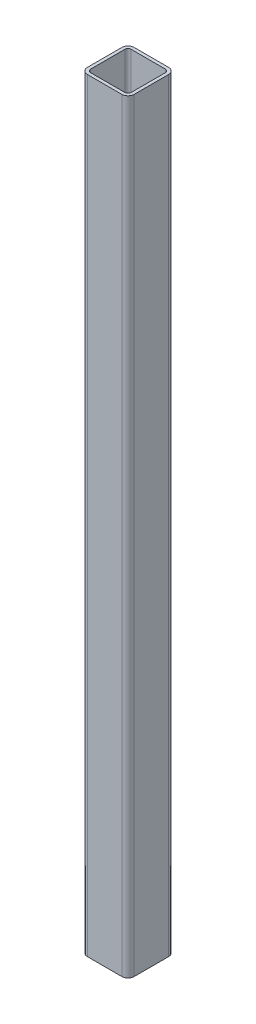
ISO-10303-21;
HEADER;
FILE_DESCRIPTION(('STEP AP214'),'2;1');
FILE_NAME('part.step','',(''),(''),'','','');
FILE_SCHEMA(('AUTOMOTIVE_DESIGN { 1 0 10303 214 1 1 1 1 }'));
ENDSEC;
DATA;
#1=APPLICATION_CONTEXT('core data for automotive mechanical design processes');
#2=APPLICATION_PROTOCOL_DEFINITION('international standard','automotive_design',2000,#1);
#3=PRODUCT_CONTEXT('',#1,'mechanical');
#4=PRODUCT('Part','Part','',(#3));
#5=PRODUCT_RELATED_PRODUCT_CATEGORY('part','',(#4));
#6=PRODUCT_DEFINITION_FORMATION('','',#4);
#7=PRODUCT_DEFINITION_CONTEXT('part definition',#1,'design');
#8=PRODUCT_DEFINITION('design','',#6,#7);
#9=PRODUCT_DEFINITION_SHAPE('','',#8);
#10=(LENGTH_UNIT() NAMED_UNIT(*) SI_UNIT(.MILLI.,.METRE.));
#11=(NAMED_UNIT(*) PLANE_ANGLE_UNIT() SI_UNIT($,.RADIAN.));
#12=(NAMED_UNIT(*) SI_UNIT($,.STERADIAN.) SOLID_ANGLE_UNIT());
#13=UNCERTAINTY_MEASURE_WITH_UNIT(LENGTH_MEASURE(1.E-05),#10,'distance_accuracy_value','');
#14=(GEOMETRIC_REPRESENTATION_CONTEXT(3) GLOBAL_UNCERTAINTY_ASSIGNED_CONTEXT((#13)) GLOBAL_UNIT_ASSIGNED_CONTEXT((#10,
#11,#12)) REPRESENTATION_CONTEXT('',''));
#15=CARTESIAN_POINT('',(0.,0.,0.));
#16=DIRECTION('',(0.,0.,1.));
#17=DIRECTION('',(1.,0.,0.));
#18=AXIS2_PLACEMENT_3D('',#15,#16,#17);
#19=CARTESIAN_POINT('',(4.00000000000003,245.,-30.));
#20=DIRECTION('',(0.,0.,1.));
#21=DIRECTION('',(1.,0.,0.));
#22=AXIS2_PLACEMENT_3D('',#19,#20,#21);
#23=PLANE('',#22);
#24=DIRECTION('',(1.,0.,0.));
#25=VECTOR('',#24,1.);
#26=CARTESIAN_POINT('',(0.,-20.,-30.));
#27=LINE('',#26,#25);
#28=CARTESIAN_POINT('',(4.,-20.,-30.));
#29=VERTEX_POINT('',#28);
#30=CARTESIAN_POINT('',(23.,-20.,-30.));
#31=VERTEX_POINT('',#30);
#32=EDGE_CURVE('E389',#29,#31,#27,.T.);
#33=ORIENTED_EDGE('',*,*,#32,.T.);
#34=DIRECTION('',(0.,1.,0.));
#35=VECTOR('',#34,1.);
#36=CARTESIAN_POINT('',(23.,20.,-30.));
#37=LINE('',#36,#35);
#38=CARTESIAN_POINT('',(23.,20.,-30.));
#39=VERTEX_POINT('',#38);
#40=EDGE_CURVE('E384',#31,#39,#37,.T.);
#41=ORIENTED_EDGE('',*,*,#40,.T.);
#42=DIRECTION('',(-1.,0.,0.));
#43=VECTOR('',#42,1.);
#44=CARTESIAN_POINT('',(0.,20.,-30.));
#45=LINE('',#44,#43);
#46=CARTESIAN_POINT('',(4.,20.,-30.));
#47=VERTEX_POINT('',#46);
#48=EDGE_CURVE('E207',#39,#47,#45,.T.);
#49=ORIENTED_EDGE('',*,*,#48,.T.);
#50=DIRECTION('',(0.,-1.,0.));
#51=VECTOR('',#50,1.);
#52=CARTESIAN_POINT('',(4.00000000000003,245.,-30.));
#53=LINE('',#52,#51);
#54=CARTESIAN_POINT('',(4.00000000000003,245.,-30.));
#55=VERTEX_POINT('',#54);
#56=EDGE_CURVE('E344',#55,#47,#53,.T.);
#57=ORIENTED_EDGE('',*,*,#56,.F.);
#58=DIRECTION('',(-1.,0.,0.));
#59=VECTOR('',#58,1.);
#60=CARTESIAN_POINT('',(4.00000000000003,245.,-30.));
#61=LINE('',#60,#59);
#62=CARTESIAN_POINT('',(26.,245.,-30.));
#63=VERTEX_POINT('',#62);
#64=EDGE_CURVE('E315',#63,#55,#61,.T.);
#65=ORIENTED_EDGE('',*,*,#64,.F.);
#66=DIRECTION('',(0.,-1.,0.));
#67=VECTOR('',#66,1.);
#68=CARTESIAN_POINT('',(26.,245.,-30.));
#69=LINE('',#68,#67);
#70=CARTESIAN_POINT('',(26.,-245.,-30.));
#71=VERTEX_POINT('',#70);
#72=EDGE_CURVE('E347',#63,#71,#69,.T.);
#73=ORIENTED_EDGE('',*,*,#72,.T.);
#74=DIRECTION('',(-1.,0.,0.));
#75=VECTOR('',#74,1.);
#76=CARTESIAN_POINT('',(4.00000000000003,-245.,-30.));
#77=LINE('',#76,#75);
#78=CARTESIAN_POINT('',(4.00000000000003,-245.,-30.));
#79=VERTEX_POINT('',#78);
#80=EDGE_CURVE('E332',#71,#79,#77,.T.);
#81=ORIENTED_EDGE('',*,*,#80,.T.);
#82=EDGE_CURVE('E343',#29,#79,#53,.T.);
#83=ORIENTED_EDGE('',*,*,#82,.F.);
#84=EDGE_LOOP('',(#33,#41,#49,#57,#65,#73,#81,#83));
#85=FACE_BOUND('',#84,.T.);
#86=ADVANCED_FACE('F34',(#85),#23,.F.);
#87=CARTESIAN_POINT('',(4.,245.,-26.));
#88=DIRECTION('',(0.,-1.,0.));
#89=DIRECTION('',(0.,0.,-1.));
#90=AXIS2_PLACEMENT_3D('',#87,#88,#89);
#91=CYLINDRICAL_SURFACE('',#90,4.);
#92=CARTESIAN_POINT('',(4.,-20.,-26.));
#93=DIRECTION('',(0.,1.,0.));
#94=DIRECTION('',(-1.,0.,0.));
#95=AXIS2_PLACEMENT_3D('',#92,#93,#94);
#96=CIRCLE('',#95,4.);
#97=CARTESIAN_POINT('',(0.,-20.,-26.));
#98=VERTEX_POINT('',#97);
#99=EDGE_CURVE('E237',#29,#98,#96,.T.);
#100=ORIENTED_EDGE('',*,*,#99,.F.);
#101=ORIENTED_EDGE('',*,*,#82,.T.);
#102=CARTESIAN_POINT('',(4.,-245.,-26.));
#103=DIRECTION('',(0.,1.,0.));
#104=DIRECTION('',(0.,0.,-1.));
#105=AXIS2_PLACEMENT_3D('',#102,#103,#104);
#106=CIRCLE('',#105,4.);
#107=CARTESIAN_POINT('',(0.,-245.,-26.));
#108=VERTEX_POINT('',#107);
#109=EDGE_CURVE('E335',#79,#108,#106,.T.);
#110=ORIENTED_EDGE('',*,*,#109,.T.);
#111=DIRECTION('',(0.,-1.,0.));
#112=VECTOR('',#111,1.);
#113=CARTESIAN_POINT('',(0.,245.,-26.));
#114=LINE('',#113,#112);
#115=EDGE_CURVE('E341',#98,#108,#114,.T.);
#116=ORIENTED_EDGE('',*,*,#115,.F.);
#117=EDGE_LOOP('',(#100,#101,#110,#116));
#118=FACE_BOUND('',#117,.T.);
#119=ADVANCED_FACE('F396',(#118),#91,.T.);
#120=CARTESIAN_POINT('',(4.,20.,-26.));
#121=DIRECTION('',(0.,-1.,0.));
#122=DIRECTION('',(1.,0.,0.));
#123=AXIS2_PLACEMENT_3D('',#120,#121,#122);
#124=CIRCLE('',#123,4.);
#125=CARTESIAN_POINT('',(0.,20.,-26.));
#126=VERTEX_POINT('',#125);
#127=EDGE_CURVE('E229',#126,#47,#124,.T.);
#128=ORIENTED_EDGE('',*,*,#127,.F.);
#129=CARTESIAN_POINT('',(0.,245.,-26.));
#130=VERTEX_POINT('',#129);
#131=EDGE_CURVE('E213',#130,#126,#114,.T.);
#132=ORIENTED_EDGE('',*,*,#131,.F.);
#133=CARTESIAN_POINT('',(4.,245.,-26.));
#134=DIRECTION('',(0.,1.,0.));
#135=DIRECTION('',(0.,0.,-1.));
#136=AXIS2_PLACEMENT_3D('',#133,#134,#135);
#137=CIRCLE('',#136,4.);
#138=EDGE_CURVE('E317',#55,#130,#137,.T.);
#139=ORIENTED_EDGE('',*,*,#138,.F.);
#140=ORIENTED_EDGE('',*,*,#56,.T.);
#141=EDGE_LOOP('',(#128,#132,#139,#140));
#142=FACE_BOUND('',#141,.T.);
#143=ADVANCED_FACE('F420',(#142),#91,.T.);
#144=CARTESIAN_POINT('',(0.,245.,-4.00000000000003));
#145=DIRECTION('',(1.,0.,0.));
#146=DIRECTION('',(0.,0.,-1.));
#147=AXIS2_PLACEMENT_3D('',#144,#145,#146);
#148=PLANE('',#147);
#149=DIRECTION('',(0.,0.,-1.));
#150=VECTOR('',#149,1.);
#151=CARTESIAN_POINT('',(0.,-20.,-12.));
#152=LINE('',#151,#150);
#153=CARTESIAN_POINT('',(0.,-20.,-12.));
#154=VERTEX_POINT('',#153);
#155=EDGE_CURVE('E49',#154,#98,#152,.T.);
#156=ORIENTED_EDGE('',*,*,#155,.T.);
#157=ORIENTED_EDGE('',*,*,#115,.T.);
#158=DIRECTION('',(0.,0.,1.));
#159=VECTOR('',#158,1.);
#160=CARTESIAN_POINT('',(0.,-245.,-4.00000000000003));
#161=LINE('',#160,#159);
#162=CARTESIAN_POINT('',(0.,-245.,-4.00000000000003));
#163=VERTEX_POINT('',#162);
#164=EDGE_CURVE('E307',#108,#163,#161,.T.);
#165=ORIENTED_EDGE('',*,*,#164,.T.);
#166=DIRECTION('',(0.,-1.,0.));
#167=VECTOR('',#166,1.);
#168=CARTESIAN_POINT('',(0.,245.,-4.00000000000003));
#169=LINE('',#168,#167);
#170=CARTESIAN_POINT('',(0.,245.,-4.00000000000003));
#171=VERTEX_POINT('',#170);
#172=EDGE_CURVE('E321',#171,#163,#169,.T.);
#173=ORIENTED_EDGE('',*,*,#172,.F.);
#174=DIRECTION('',(0.,0.,1.));
#175=VECTOR('',#174,1.);
#176=CARTESIAN_POINT('',(0.,245.,-4.00000000000003));
#177=LINE('',#176,#175);
#178=EDGE_CURVE('E319',#130,#171,#177,.T.);
#179=ORIENTED_EDGE('',*,*,#178,.F.);
#180=ORIENTED_EDGE('',*,*,#131,.T.);
#181=DIRECTION('',(0.,0.,-1.));
#182=VECTOR('',#181,1.);
#183=CARTESIAN_POINT('',(0.,20.,-12.));
#184=LINE('',#183,#182);
#185=CARTESIAN_POINT('',(0.,20.,-12.));
#186=VERTEX_POINT('',#185);
#187=EDGE_CURVE('E196',#186,#126,#184,.T.);
#188=ORIENTED_EDGE('',*,*,#187,.F.);
#189=DIRECTION('',(0.,-1.,0.));
#190=VECTOR('',#189,1.);
#191=CARTESIAN_POINT('',(0.,20.,-12.));
#192=LINE('',#191,#190);
#193=EDGE_CURVE('E204',#186,#154,#192,.T.);
#194=ORIENTED_EDGE('',*,*,#193,.T.);
#195=EDGE_LOOP('',(#156,#157,#165,#173,#179,#180,#188,#194));
#196=FACE_BOUND('',#195,.T.);
#197=ADVANCED_FACE('F210',(#196),#148,.F.);
#198=CARTESIAN_POINT('',(4.00000000000003,245.,-28.));
#199=DIRECTION('',(0.,0.,1.));
#200=DIRECTION('',(1.,0.,0.));
#201=AXIS2_PLACEMENT_3D('',#198,#199,#200);
#202=PLANE('',#201);
#203=DIRECTION('',(0.,-1.,0.));
#204=VECTOR('',#203,1.);
#205=CARTESIAN_POINT('',(23.,245.,-28.));
#206=LINE('',#205,#204);
#207=CARTESIAN_POINT('',(23.,20.,-28.));
#208=VERTEX_POINT('',#207);
#209=CARTESIAN_POINT('',(23.,-20.,-28.));
#210=VERTEX_POINT('',#209);
#211=EDGE_CURVE('E11',#208,#210,#206,.T.);
#212=ORIENTED_EDGE('',*,*,#211,.T.);
#213=DIRECTION('',(-1.,0.,0.));
#214=VECTOR('',#213,1.);
#215=CARTESIAN_POINT('',(3.99999999999999,-20.,-28.));
#216=LINE('',#215,#214);
#217=CARTESIAN_POINT('',(4.00000000000003,-20.,-28.));
#218=VERTEX_POINT('',#217);
#219=EDGE_CURVE('E234',#210,#218,#216,.T.);
#220=ORIENTED_EDGE('',*,*,#219,.T.);
#221=DIRECTION('',(0.,-1.,0.));
#222=VECTOR('',#221,1.);
#223=CARTESIAN_POINT('',(4.00000000000003,245.,-28.));
#224=LINE('',#223,#222);
#225=CARTESIAN_POINT('',(4.00000000000003,-245.,-28.));
#226=VERTEX_POINT('',#225);
#227=EDGE_CURVE('E287',#218,#226,#224,.T.);
#228=ORIENTED_EDGE('',*,*,#227,.T.);
#229=DIRECTION('',(-1.,0.,0.));
#230=VECTOR('',#229,1.);
#231=CARTESIAN_POINT('',(4.00000000000003,-245.,-28.));
#232=LINE('',#231,#230);
#233=CARTESIAN_POINT('',(26.,-245.,-28.));
#234=VERTEX_POINT('',#233);
#235=EDGE_CURVE('E273',#234,#226,#232,.T.);
#236=ORIENTED_EDGE('',*,*,#235,.F.);
#237=DIRECTION('',(0.,-1.,0.));
#238=VECTOR('',#237,1.);
#239=CARTESIAN_POINT('',(26.,245.,-28.));
#240=LINE('',#239,#238);
#241=CARTESIAN_POINT('',(26.,245.,-28.));
#242=VERTEX_POINT('',#241);
#243=EDGE_CURVE('E291',#242,#234,#240,.T.);
#244=ORIENTED_EDGE('',*,*,#243,.F.);
#245=DIRECTION('',(-1.,0.,0.));
#246=VECTOR('',#245,1.);
#247=CARTESIAN_POINT('',(4.00000000000003,245.,-28.));
#248=LINE('',#247,#246);
#249=CARTESIAN_POINT('',(4.00000000000003,245.,-28.));
#250=VERTEX_POINT('',#249);
#251=EDGE_CURVE('E251',#242,#250,#248,.T.);
#252=ORIENTED_EDGE('',*,*,#251,.T.);
#253=CARTESIAN_POINT('',(4.00000000000003,20.,-28.));
#254=VERTEX_POINT('',#253);
#255=EDGE_CURVE('E288',#250,#254,#224,.T.);
#256=ORIENTED_EDGE('',*,*,#255,.T.);
#257=DIRECTION('',(1.,0.,0.));
#258=VECTOR('',#257,1.);
#259=CARTESIAN_POINT('',(4.00000000000006,20.,-28.));
#260=LINE('',#259,#258);
#261=EDGE_CURVE('E226',#254,#208,#260,.T.);
#262=ORIENTED_EDGE('',*,*,#261,.T.);
#263=EDGE_LOOP('',(#212,#220,#228,#236,#244,#252,#256,#262));
#264=FACE_BOUND('',#263,.T.);
#265=ADVANCED_FACE('F376',(#264),#202,.T.);
#266=CARTESIAN_POINT('',(4.,245.,-26.));
#267=DIRECTION('',(0.,-1.,0.));
#268=DIRECTION('',(0.,0.,-1.));
#269=AXIS2_PLACEMENT_3D('',#266,#267,#268);
#270=CYLINDRICAL_SURFACE('',#269,2.);
#271=ORIENTED_EDGE('',*,*,#227,.F.);
#272=CARTESIAN_POINT('',(4.,-20.,-26.));
#273=DIRECTION('',(0.,1.,0.));
#274=DIRECTION('',(-1.,0.,0.));
#275=AXIS2_PLACEMENT_3D('',#272,#273,#274);
#276=CIRCLE('',#275,2.);
#277=CARTESIAN_POINT('',(2.,-20.,-26.));
#278=VERTEX_POINT('',#277);
#279=EDGE_CURVE('E231',#218,#278,#276,.T.);
#280=ORIENTED_EDGE('',*,*,#279,.T.);
#281=DIRECTION('',(0.,-1.,0.));
#282=VECTOR('',#281,1.);
#283=CARTESIAN_POINT('',(2.,245.,-26.));
#284=LINE('',#283,#282);
#285=CARTESIAN_POINT('',(2.,-245.,-26.));
#286=VERTEX_POINT('',#285);
#287=EDGE_CURVE('E283',#278,#286,#284,.T.);
#288=ORIENTED_EDGE('',*,*,#287,.T.);
#289=CARTESIAN_POINT('',(4.,-245.,-26.));
#290=DIRECTION('',(0.,1.,0.));
#291=DIRECTION('',(0.,0.,-1.));
#292=AXIS2_PLACEMENT_3D('',#289,#290,#291);
#293=CIRCLE('',#292,2.);
#294=EDGE_CURVE('E276',#226,#286,#293,.T.);
#295=ORIENTED_EDGE('',*,*,#294,.F.);
#296=EDGE_LOOP('',(#271,#280,#288,#295));
#297=FACE_BOUND('',#296,.T.);
#298=ADVANCED_FACE('F372',(#297),#270,.F.);
#299=CARTESIAN_POINT('',(2.,245.,-26.));
#300=VERTEX_POINT('',#299);
#301=CARTESIAN_POINT('',(2.,20.,-26.));
#302=VERTEX_POINT('',#301);
#303=EDGE_CURVE('E284',#300,#302,#284,.T.);
#304=ORIENTED_EDGE('',*,*,#303,.T.);
#305=CARTESIAN_POINT('',(4.,20.,-26.));
#306=DIRECTION('',(0.,-1.,0.));
#307=DIRECTION('',(1.,0.,0.));
#308=AXIS2_PLACEMENT_3D('',#305,#306,#307);
#309=CIRCLE('',#308,2.);
#310=EDGE_CURVE('E223',#302,#254,#309,.T.);
#311=ORIENTED_EDGE('',*,*,#310,.T.);
#312=ORIENTED_EDGE('',*,*,#255,.F.);
#313=CARTESIAN_POINT('',(4.,245.,-26.));
#314=DIRECTION('',(0.,1.,0.));
#315=DIRECTION('',(0.,0.,-1.));
#316=AXIS2_PLACEMENT_3D('',#313,#314,#315);
#317=CIRCLE('',#316,2.);
#318=EDGE_CURVE('E253',#250,#300,#317,.T.);
#319=ORIENTED_EDGE('',*,*,#318,.T.);
#320=EDGE_LOOP('',(#304,#311,#312,#319));
#321=FACE_BOUND('',#320,.T.);
#322=ADVANCED_FACE('F572',(#321),#270,.F.);
#323=CARTESIAN_POINT('',(2.,245.,-4.00000000000003));
#324=DIRECTION('',(1.,0.,0.));
#325=DIRECTION('',(0.,0.,-1.));
#326=AXIS2_PLACEMENT_3D('',#323,#324,#325);
#327=PLANE('',#326);
#328=ORIENTED_EDGE('',*,*,#287,.F.);
#329=DIRECTION('',(0.,0.,1.));
#330=VECTOR('',#329,1.);
#331=CARTESIAN_POINT('',(2.,-20.,-4.00000000000003));
#332=LINE('',#331,#330);
#333=CARTESIAN_POINT('',(2.,-20.,-12.));
#334=VERTEX_POINT('',#333);
#335=EDGE_CURVE('E42',#278,#334,#332,.T.);
#336=ORIENTED_EDGE('',*,*,#335,.T.);
#337=DIRECTION('',(0.,-1.,0.));
#338=VECTOR('',#337,1.);
#339=CARTESIAN_POINT('',(2.,245.,-12.));
#340=LINE('',#339,#338);
#341=CARTESIAN_POINT('',(2.,20.,-12.));
#342=VERTEX_POINT('',#341);
#343=EDGE_CURVE('E362',#342,#334,#340,.T.);
#344=ORIENTED_EDGE('',*,*,#343,.F.);
#345=DIRECTION('',(0.,0.,-1.));
#346=VECTOR('',#345,1.);
#347=CARTESIAN_POINT('',(2.,20.,-4.00000000000003));
#348=LINE('',#347,#346);
#349=EDGE_CURVE('E199',#342,#302,#348,.T.);
#350=ORIENTED_EDGE('',*,*,#349,.T.);
#351=ORIENTED_EDGE('',*,*,#303,.F.);
#352=DIRECTION('',(0.,0.,1.));
#353=VECTOR('',#352,1.);
#354=CARTESIAN_POINT('',(2.,245.,-4.00000000000003));
#355=LINE('',#354,#353);
#356=CARTESIAN_POINT('',(2.,245.,-4.00000000000003));
#357=VERTEX_POINT('',#356);
#358=EDGE_CURVE('E256',#300,#357,#355,.T.);
#359=ORIENTED_EDGE('',*,*,#358,.T.);
#360=DIRECTION('',(0.,-1.,0.));
#361=VECTOR('',#360,1.);
#362=CARTESIAN_POINT('',(2.,245.,-4.00000000000003));
#363=LINE('',#362,#361);
#364=CARTESIAN_POINT('',(2.,-245.,-4.00000000000003));
#365=VERTEX_POINT('',#364);
#366=EDGE_CURVE('E258',#357,#365,#363,.T.);
#367=ORIENTED_EDGE('',*,*,#366,.T.);
#368=DIRECTION('',(0.,0.,1.));
#369=VECTOR('',#368,1.);
#370=CARTESIAN_POINT('',(2.,-245.,-4.00000000000003));
#371=LINE('',#370,#369);
#372=EDGE_CURVE('E243',#286,#365,#371,.T.);
#373=ORIENTED_EDGE('',*,*,#372,.F.);
#374=EDGE_LOOP('',(#328,#336,#344,#350,#351,#359,#367,#373));
#375=FACE_BOUND('',#374,.T.);
#376=ADVANCED_FACE('F367',(#375),#327,.T.);
#377=CARTESIAN_POINT('',(4.,245.,-4.));
#378=DIRECTION('',(0.,-1.,0.));
#379=DIRECTION('',(0.,0.,-1.));
#380=AXIS2_PLACEMENT_3D('',#377,#378,#379);
#381=PLANE('',#380);
#382=CARTESIAN_POINT('',(4.,245.,-4.));
#383=DIRECTION('',(0.,1.,0.));
#384=DIRECTION('',(0.,0.,-1.));
#385=AXIS2_PLACEMENT_3D('',#382,#383,#384);
#386=CIRCLE('',#385,4.);
#387=CARTESIAN_POINT('',(4.00000000000003,245.,0.));
#388=VERTEX_POINT('',#387);
#389=EDGE_CURVE('E303',#171,#388,#386,.T.);
#390=ORIENTED_EDGE('',*,*,#389,.T.);
#391=DIRECTION('',(1.,0.,0.));
#392=VECTOR('',#391,1.);
#393=CARTESIAN_POINT('',(4.00000000000003,245.,0.));
#394=LINE('',#393,#392);
#395=CARTESIAN_POINT('',(26.,245.,0.));
#396=VERTEX_POINT('',#395);
#397=EDGE_CURVE('E306',#388,#396,#394,.T.);
#398=ORIENTED_EDGE('',*,*,#397,.T.);
#399=CARTESIAN_POINT('',(26.,245.,-4.));
#400=DIRECTION('',(0.,1.,0.));
#401=DIRECTION('',(0.,0.,1.));
#402=AXIS2_PLACEMENT_3D('',#399,#400,#401);
#403=CIRCLE('',#402,4.);
#404=CARTESIAN_POINT('',(30.,245.,-4.00000000000003));
#405=VERTEX_POINT('',#404);
#406=EDGE_CURVE('E309',#396,#405,#403,.T.);
#407=ORIENTED_EDGE('',*,*,#406,.T.);
#408=DIRECTION('',(0.,0.,-1.));
#409=VECTOR('',#408,1.);
#410=CARTESIAN_POINT('',(30.,245.,-4.00000000000003));
#411=LINE('',#410,#409);
#412=CARTESIAN_POINT('',(30.,245.,-26.));
#413=VERTEX_POINT('',#412);
#414=EDGE_CURVE('E311',#405,#413,#411,.T.);
#415=ORIENTED_EDGE('',*,*,#414,.T.);
#416=CARTESIAN_POINT('',(26.,245.,-26.));
#417=DIRECTION('',(0.,1.,0.));
#418=DIRECTION('',(0.,0.,-1.));
#419=AXIS2_PLACEMENT_3D('',#416,#417,#418);
#420=CIRCLE('',#419,4.);
#421=EDGE_CURVE('E313',#413,#63,#420,.T.);
#422=ORIENTED_EDGE('',*,*,#421,.T.);
#423=ORIENTED_EDGE('',*,*,#64,.T.);
#424=ORIENTED_EDGE('',*,*,#138,.T.);
#425=ORIENTED_EDGE('',*,*,#178,.T.);
#426=EDGE_LOOP('',(#390,#398,#407,#415,#422,#423,#424,#425));
#427=FACE_BOUND('',#426,.T.);
#428=CARTESIAN_POINT('',(4.,245.,-4.));
#429=DIRECTION('',(0.,1.,0.));
#430=DIRECTION('',(0.,0.,-1.));
#431=AXIS2_PLACEMENT_3D('',#428,#429,#430);
#432=CIRCLE('',#431,2.);
#433=CARTESIAN_POINT('',(4.00000000000003,245.,-2.));
#434=VERTEX_POINT('',#433);
#435=EDGE_CURVE('E240',#357,#434,#432,.T.);
#436=ORIENTED_EDGE('',*,*,#435,.F.);
#437=ORIENTED_EDGE('',*,*,#358,.F.);
#438=ORIENTED_EDGE('',*,*,#318,.F.);
#439=ORIENTED_EDGE('',*,*,#251,.F.);
#440=CARTESIAN_POINT('',(26.,245.,-26.));
#441=DIRECTION('',(0.,1.,0.));
#442=DIRECTION('',(0.,0.,-1.));
#443=AXIS2_PLACEMENT_3D('',#440,#441,#442);
#444=CIRCLE('',#443,2.);
#445=CARTESIAN_POINT('',(28.,245.,-26.));
#446=VERTEX_POINT('',#445);
#447=EDGE_CURVE('E249',#446,#242,#444,.T.);
#448=ORIENTED_EDGE('',*,*,#447,.F.);
#449=DIRECTION('',(0.,0.,-1.));
#450=VECTOR('',#449,1.);
#451=CARTESIAN_POINT('',(28.,245.,-4.00000000000001));
#452=LINE('',#451,#450);
#453=CARTESIAN_POINT('',(28.,245.,-4.00000000000001));
#454=VERTEX_POINT('',#453);
#455=EDGE_CURVE('E247',#454,#446,#452,.T.);
#456=ORIENTED_EDGE('',*,*,#455,.F.);
#457=CARTESIAN_POINT('',(26.,245.,-4.));
#458=DIRECTION('',(0.,1.,0.));
#459=DIRECTION('',(0.,0.,1.));
#460=AXIS2_PLACEMENT_3D('',#457,#458,#459);
#461=CIRCLE('',#460,2.);
#462=CARTESIAN_POINT('',(26.,245.,-2.));
#463=VERTEX_POINT('',#462);
#464=EDGE_CURVE('E245',#463,#454,#461,.T.);
#465=ORIENTED_EDGE('',*,*,#464,.F.);
#466=DIRECTION('',(1.,0.,0.));
#467=VECTOR('',#466,1.);
#468=CARTESIAN_POINT('',(4.00000000000003,245.,-2.));
#469=LINE('',#468,#467);
#470=EDGE_CURVE('E242',#434,#463,#469,.T.);
#471=ORIENTED_EDGE('',*,*,#470,.F.);
#472=EDGE_LOOP('',(#436,#437,#438,#439,#448,#456,#465,#471));
#473=FACE_BOUND('',#472,.T.);
#474=ADVANCED_FACE('F414',(#427,#473),#381,.F.);
#475=CARTESIAN_POINT('',(4.,-245.,-4.));
#476=DIRECTION('',(0.,-1.,0.));
#477=DIRECTION('',(0.,0.,-1.));
#478=AXIS2_PLACEMENT_3D('',#475,#476,#477);
#479=PLANE('',#478);
#480=CARTESIAN_POINT('',(4.,-245.,-4.));
#481=DIRECTION('',(0.,1.,0.));
#482=DIRECTION('',(0.,0.,-1.));
#483=AXIS2_PLACEMENT_3D('',#480,#481,#482);
#484=CIRCLE('',#483,4.);
#485=CARTESIAN_POINT('',(4.00000000000003,-245.,0.));
#486=VERTEX_POINT('',#485);
#487=EDGE_CURVE('E302',#163,#486,#484,.T.);
#488=ORIENTED_EDGE('',*,*,#487,.F.);
#489=ORIENTED_EDGE('',*,*,#164,.F.);
#490=ORIENTED_EDGE('',*,*,#109,.F.);
#491=ORIENTED_EDGE('',*,*,#80,.F.);
#492=CARTESIAN_POINT('',(26.,-245.,-26.));
#493=DIRECTION('',(0.,1.,0.));
#494=DIRECTION('',(0.,0.,-1.));
#495=AXIS2_PLACEMENT_3D('',#492,#493,#494);
#496=CIRCLE('',#495,4.);
#497=CARTESIAN_POINT('',(30.,-245.,-26.));
#498=VERTEX_POINT('',#497);
#499=EDGE_CURVE('E330',#498,#71,#496,.T.);
#500=ORIENTED_EDGE('',*,*,#499,.F.);
#501=DIRECTION('',(0.,0.,-1.));
#502=VECTOR('',#501,1.);
#503=CARTESIAN_POINT('',(30.,-245.,-4.00000000000003));
#504=LINE('',#503,#502);
#505=CARTESIAN_POINT('',(30.,-245.,-4.00000000000003));
#506=VERTEX_POINT('',#505);
#507=EDGE_CURVE('E328',#506,#498,#504,.T.);
#508=ORIENTED_EDGE('',*,*,#507,.F.);
#509=CARTESIAN_POINT('',(26.,-245.,-4.));
#510=DIRECTION('',(0.,1.,0.));
#511=DIRECTION('',(0.,0.,1.));
#512=AXIS2_PLACEMENT_3D('',#509,#510,#511);
#513=CIRCLE('',#512,4.);
#514=CARTESIAN_POINT('',(26.,-245.,0.));
#515=VERTEX_POINT('',#514);
#516=EDGE_CURVE('E326',#515,#506,#513,.T.);
#517=ORIENTED_EDGE('',*,*,#516,.F.);
#518=DIRECTION('',(1.,0.,0.));
#519=VECTOR('',#518,1.);
#520=CARTESIAN_POINT('',(4.00000000000003,-245.,0.));
#521=LINE('',#520,#519);
#522=EDGE_CURVE('E324',#486,#515,#521,.T.);
#523=ORIENTED_EDGE('',*,*,#522,.F.);
#524=EDGE_LOOP('',(#488,#489,#490,#491,#500,#508,#517,#523));
#525=FACE_BOUND('',#524,.T.);
#526=ORIENTED_EDGE('',*,*,#372,.T.);
#527=CARTESIAN_POINT('',(4.,-245.,-4.));
#528=DIRECTION('',(0.,1.,0.));
#529=DIRECTION('',(0.,0.,-1.));
#530=AXIS2_PLACEMENT_3D('',#527,#528,#529);
#531=CIRCLE('',#530,2.);
#532=CARTESIAN_POINT('',(4.00000000000003,-245.,-2.));
#533=VERTEX_POINT('',#532);
#534=EDGE_CURVE('E239',#365,#533,#531,.T.);
#535=ORIENTED_EDGE('',*,*,#534,.T.);
#536=DIRECTION('',(1.,0.,0.));
#537=VECTOR('',#536,1.);
#538=CARTESIAN_POINT('',(4.00000000000003,-245.,-2.));
#539=LINE('',#538,#537);
#540=CARTESIAN_POINT('',(26.,-245.,-2.));
#541=VERTEX_POINT('',#540);
#542=EDGE_CURVE('E261',#533,#541,#539,.T.);
#543=ORIENTED_EDGE('',*,*,#542,.T.);
#544=CARTESIAN_POINT('',(26.,-245.,-4.));
#545=DIRECTION('',(0.,1.,0.));
#546=DIRECTION('',(0.,0.,1.));
#547=AXIS2_PLACEMENT_3D('',#544,#545,#546);
#548=CIRCLE('',#547,2.);
#549=CARTESIAN_POINT('',(28.,-245.,-4.00000000000001));
#550=VERTEX_POINT('',#549);
#551=EDGE_CURVE('E264',#541,#550,#548,.T.);
#552=ORIENTED_EDGE('',*,*,#551,.T.);
#553=DIRECTION('',(0.,0.,-1.));
#554=VECTOR('',#553,1.);
#555=CARTESIAN_POINT('',(28.,-245.,-4.00000000000001));
#556=LINE('',#555,#554);
#557=CARTESIAN_POINT('',(28.,-245.,-26.));
#558=VERTEX_POINT('',#557);
#559=EDGE_CURVE('E267',#550,#558,#556,.T.);
#560=ORIENTED_EDGE('',*,*,#559,.T.);
#561=CARTESIAN_POINT('',(26.,-245.,-26.));
#562=DIRECTION('',(0.,1.,0.));
#563=DIRECTION('',(0.,0.,-1.));
#564=AXIS2_PLACEMENT_3D('',#561,#562,#563);
#565=CIRCLE('',#564,2.);
#566=EDGE_CURVE('E270',#558,#234,#565,.T.);
#567=ORIENTED_EDGE('',*,*,#566,.T.);
#568=ORIENTED_EDGE('',*,*,#235,.T.);
#569=ORIENTED_EDGE('',*,*,#294,.T.);
#570=EDGE_LOOP('',(#526,#535,#543,#552,#560,#567,#568,#569));
#571=FACE_BOUND('',#570,.T.);
#572=ADVANCED_FACE('F405',(#525,#571),#479,.T.);
#573=CARTESIAN_POINT('',(4.,245.,-4.));
#574=DIRECTION('',(0.,-1.,0.));
#575=DIRECTION('',(0.,0.,-1.));
#576=AXIS2_PLACEMENT_3D('',#573,#574,#575);
#577=CYLINDRICAL_SURFACE('',#576,4.);
#578=ORIENTED_EDGE('',*,*,#487,.T.);
#579=DIRECTION('',(0.,-1.,0.));
#580=VECTOR('',#579,1.);
#581=CARTESIAN_POINT('',(4.00000000000003,245.,0.));
#582=LINE('',#581,#580);
#583=EDGE_CURVE('E359',#388,#486,#582,.T.);
#584=ORIENTED_EDGE('',*,*,#583,.F.);
#585=ORIENTED_EDGE('',*,*,#389,.F.);
#586=ORIENTED_EDGE('',*,*,#172,.T.);
#587=EDGE_LOOP('',(#578,#584,#585,#586));
#588=FACE_BOUND('',#587,.T.);
#589=ADVANCED_FACE('F36',(#588),#577,.T.);
#590=CARTESIAN_POINT('',(4.00000000000003,245.,0.));
#591=DIRECTION('',(0.,0.,-1.));
#592=DIRECTION('',(-1.,0.,0.));
#593=AXIS2_PLACEMENT_3D('',#590,#591,#592);
#594=PLANE('',#593);
#595=ORIENTED_EDGE('',*,*,#522,.T.);
#596=DIRECTION('',(0.,-1.,0.));
#597=VECTOR('',#596,1.);
#598=CARTESIAN_POINT('',(26.,245.,0.));
#599=LINE('',#598,#597);
#600=EDGE_CURVE('E356',#396,#515,#599,.T.);
#601=ORIENTED_EDGE('',*,*,#600,.F.);
#602=ORIENTED_EDGE('',*,*,#397,.F.);
#603=ORIENTED_EDGE('',*,*,#583,.T.);
#604=EDGE_LOOP('',(#595,#601,#602,#603));
#605=FACE_BOUND('',#604,.T.);
#606=ADVANCED_FACE('F411',(#605),#594,.F.);
#607=CARTESIAN_POINT('',(26.,245.,-4.));
#608=DIRECTION('',(0.,-1.,0.));
#609=DIRECTION('',(0.,0.,-1.));
#610=AXIS2_PLACEMENT_3D('',#607,#608,#609);
#611=CYLINDRICAL_SURFACE('',#610,4.);
#612=ORIENTED_EDGE('',*,*,#516,.T.);
#613=DIRECTION('',(0.,-1.,0.));
#614=VECTOR('',#613,1.);
#615=CARTESIAN_POINT('',(30.,245.,-4.00000000000003));
#616=LINE('',#615,#614);
#617=EDGE_CURVE('E353',#405,#506,#616,.T.);
#618=ORIENTED_EDGE('',*,*,#617,.F.);
#619=ORIENTED_EDGE('',*,*,#406,.F.);
#620=ORIENTED_EDGE('',*,*,#600,.T.);
#621=EDGE_LOOP('',(#612,#618,#619,#620));
#622=FACE_BOUND('',#621,.T.);
#623=ADVANCED_FACE('F433',(#622),#611,.T.);
#624=CARTESIAN_POINT('',(30.,245.,-4.00000000000003));
#625=DIRECTION('',(-1.,0.,0.));
#626=DIRECTION('',(0.,0.,1.));
#627=AXIS2_PLACEMENT_3D('',#624,#625,#626);
#628=PLANE('',#627);
#629=ORIENTED_EDGE('',*,*,#507,.T.);
#630=DIRECTION('',(0.,-1.,0.));
#631=VECTOR('',#630,1.);
#632=CARTESIAN_POINT('',(30.,245.,-26.));
#633=LINE('',#632,#631);
#634=EDGE_CURVE('E350',#413,#498,#633,.T.);
#635=ORIENTED_EDGE('',*,*,#634,.F.);
#636=ORIENTED_EDGE('',*,*,#414,.F.);
#637=ORIENTED_EDGE('',*,*,#617,.T.);
#638=EDGE_LOOP('',(#629,#635,#636,#637));
#639=FACE_BOUND('',#638,.T.);
#640=ADVANCED_FACE('F430',(#639),#628,.F.);
#641=CARTESIAN_POINT('',(26.,245.,-26.));
#642=DIRECTION('',(0.,-1.,0.));
#643=DIRECTION('',(0.,0.,-1.));
#644=AXIS2_PLACEMENT_3D('',#641,#642,#643);
#645=CYLINDRICAL_SURFACE('',#644,4.);
#646=ORIENTED_EDGE('',*,*,#499,.T.);
#647=ORIENTED_EDGE('',*,*,#72,.F.);
#648=ORIENTED_EDGE('',*,*,#421,.F.);
#649=ORIENTED_EDGE('',*,*,#634,.T.);
#650=EDGE_LOOP('',(#646,#647,#648,#649));
#651=FACE_BOUND('',#650,.T.);
#652=ADVANCED_FACE('F426',(#651),#645,.T.);
#653=CARTESIAN_POINT('',(4.,245.,-4.));
#654=DIRECTION('',(0.,-1.,0.));
#655=DIRECTION('',(0.,0.,-1.));
#656=AXIS2_PLACEMENT_3D('',#653,#654,#655);
#657=CYLINDRICAL_SURFACE('',#656,2.);
#658=ORIENTED_EDGE('',*,*,#534,.F.);
#659=ORIENTED_EDGE('',*,*,#366,.F.);
#660=ORIENTED_EDGE('',*,*,#435,.T.);
#661=DIRECTION('',(0.,-1.,0.));
#662=VECTOR('',#661,1.);
#663=CARTESIAN_POINT('',(4.00000000000003,245.,-2.));
#664=LINE('',#663,#662);
#665=EDGE_CURVE('E299',#434,#533,#664,.T.);
#666=ORIENTED_EDGE('',*,*,#665,.T.);
#667=EDGE_LOOP('',(#658,#659,#660,#666));
#668=FACE_BOUND('',#667,.T.);
#669=ADVANCED_FACE('F450',(#668),#657,.F.);
#670=CARTESIAN_POINT('',(4.00000000000003,245.,-2.));
#671=DIRECTION('',(0.,0.,-1.));
#672=DIRECTION('',(-1.,0.,0.));
#673=AXIS2_PLACEMENT_3D('',#670,#671,#672);
#674=PLANE('',#673);
#675=ORIENTED_EDGE('',*,*,#542,.F.);
#676=ORIENTED_EDGE('',*,*,#665,.F.);
#677=ORIENTED_EDGE('',*,*,#470,.T.);
#678=DIRECTION('',(0.,-1.,0.));
#679=VECTOR('',#678,1.);
#680=CARTESIAN_POINT('',(26.,245.,-2.));
#681=LINE('',#680,#679);
#682=EDGE_CURVE('E297',#463,#541,#681,.T.);
#683=ORIENTED_EDGE('',*,*,#682,.T.);
#684=EDGE_LOOP('',(#675,#676,#677,#683));
#685=FACE_BOUND('',#684,.T.);
#686=ADVANCED_FACE('F454',(#685),#674,.T.);
#687=CARTESIAN_POINT('',(26.,245.,-4.));
#688=DIRECTION('',(0.,-1.,0.));
#689=DIRECTION('',(0.,0.,-1.));
#690=AXIS2_PLACEMENT_3D('',#687,#688,#689);
#691=CYLINDRICAL_SURFACE('',#690,2.);
#692=ORIENTED_EDGE('',*,*,#551,.F.);
#693=ORIENTED_EDGE('',*,*,#682,.F.);
#694=ORIENTED_EDGE('',*,*,#464,.T.);
#695=DIRECTION('',(0.,-1.,0.));
#696=VECTOR('',#695,1.);
#697=CARTESIAN_POINT('',(28.,245.,-4.00000000000001));
#698=LINE('',#697,#696);
#699=EDGE_CURVE('E295',#454,#550,#698,.T.);
#700=ORIENTED_EDGE('',*,*,#699,.T.);
#701=EDGE_LOOP('',(#692,#693,#694,#700));
#702=FACE_BOUND('',#701,.T.);
#703=ADVANCED_FACE('F460',(#702),#691,.F.);
#704=CARTESIAN_POINT('',(28.,245.,-4.00000000000001));
#705=DIRECTION('',(-1.,0.,0.));
#706=DIRECTION('',(0.,0.,1.));
#707=AXIS2_PLACEMENT_3D('',#704,#705,#706);
#708=PLANE('',#707);
#709=ORIENTED_EDGE('',*,*,#559,.F.);
#710=ORIENTED_EDGE('',*,*,#699,.F.);
#711=ORIENTED_EDGE('',*,*,#455,.T.);
#712=DIRECTION('',(0.,-1.,0.));
#713=VECTOR('',#712,1.);
#714=CARTESIAN_POINT('',(28.,245.,-26.));
#715=LINE('',#714,#713);
#716=EDGE_CURVE('E293',#446,#558,#715,.T.);
#717=ORIENTED_EDGE('',*,*,#716,.T.);
#718=EDGE_LOOP('',(#709,#710,#711,#717));
#719=FACE_BOUND('',#718,.T.);
#720=ADVANCED_FACE('F495',(#719),#708,.T.);
#721=CARTESIAN_POINT('',(26.,245.,-26.));
#722=DIRECTION('',(0.,-1.,0.));
#723=DIRECTION('',(0.,0.,-1.));
#724=AXIS2_PLACEMENT_3D('',#721,#722,#723);
#725=CYLINDRICAL_SURFACE('',#724,2.);
#726=ORIENTED_EDGE('',*,*,#566,.F.);
#727=ORIENTED_EDGE('',*,*,#716,.F.);
#728=ORIENTED_EDGE('',*,*,#447,.T.);
#729=ORIENTED_EDGE('',*,*,#243,.T.);
#730=EDGE_LOOP('',(#726,#727,#728,#729));
#731=FACE_BOUND('',#730,.T.);
#732=ADVANCED_FACE('F490',(#731),#725,.F.);
#733=CARTESIAN_POINT('',(0.,-20.,-12.));
#734=DIRECTION('',(0.,1.,0.));
#735=DIRECTION('',(-1.,0.,0.));
#736=AXIS2_PLACEMENT_3D('',#733,#734,#735);
#737=PLANE('',#736);
#738=ORIENTED_EDGE('',*,*,#99,.T.);
#739=ORIENTED_EDGE('',*,*,#155,.F.);
#740=DIRECTION('',(1.,0.,0.));
#741=VECTOR('',#740,1.);
#742=CARTESIAN_POINT('',(0.,-20.,-12.));
#743=LINE('',#742,#741);
#744=EDGE_CURVE('E201',#154,#334,#743,.T.);
#745=ORIENTED_EDGE('',*,*,#744,.T.);
#746=ORIENTED_EDGE('',*,*,#335,.F.);
#747=ORIENTED_EDGE('',*,*,#279,.F.);
#748=ORIENTED_EDGE('',*,*,#219,.F.);
#749=DIRECTION('',(0.,0.,-1.));
#750=VECTOR('',#749,1.);
#751=CARTESIAN_POINT('',(23.,-20.,-12.));
#752=LINE('',#751,#750);
#753=EDGE_CURVE('E216',#210,#31,#752,.T.);
#754=ORIENTED_EDGE('',*,*,#753,.T.);
#755=ORIENTED_EDGE('',*,*,#32,.F.);
#756=EDGE_LOOP('',(#738,#739,#745,#746,#747,#748,#754,#755));
#757=FACE_BOUND('',#756,.T.);
#758=ADVANCED_FACE('F369',(#757),#737,.T.);
#759=CARTESIAN_POINT('',(0.,20.,-12.));
#760=DIRECTION('',(0.,-1.,0.));
#761=DIRECTION('',(1.,0.,0.));
#762=AXIS2_PLACEMENT_3D('',#759,#760,#761);
#763=PLANE('',#762);
#764=ORIENTED_EDGE('',*,*,#127,.T.);
#765=ORIENTED_EDGE('',*,*,#48,.F.);
#766=DIRECTION('',(0.,0.,-1.));
#767=VECTOR('',#766,1.);
#768=CARTESIAN_POINT('',(23.,20.,-12.));
#769=LINE('',#768,#767);
#770=EDGE_CURVE('E214',#208,#39,#769,.T.);
#771=ORIENTED_EDGE('',*,*,#770,.F.);
#772=ORIENTED_EDGE('',*,*,#261,.F.);
#773=ORIENTED_EDGE('',*,*,#310,.F.);
#774=ORIENTED_EDGE('',*,*,#349,.F.);
#775=DIRECTION('',(-1.,0.,0.));
#776=VECTOR('',#775,1.);
#777=CARTESIAN_POINT('',(0.,20.,-12.));
#778=LINE('',#777,#776);
#779=EDGE_CURVE('E57',#342,#186,#778,.T.);
#780=ORIENTED_EDGE('',*,*,#779,.T.);
#781=ORIENTED_EDGE('',*,*,#187,.T.);
#782=EDGE_LOOP('',(#764,#765,#771,#772,#773,#774,#780,#781));
#783=FACE_BOUND('',#782,.T.);
#784=ADVANCED_FACE('F194',(#783),#763,.T.);
#785=CARTESIAN_POINT('',(23.,20.,-12.));
#786=DIRECTION('',(-1.,0.,0.));
#787=DIRECTION('',(0.,0.,1.));
#788=AXIS2_PLACEMENT_3D('',#785,#786,#787);
#789=PLANE('',#788);
#790=ORIENTED_EDGE('',*,*,#770,.T.);
#791=ORIENTED_EDGE('',*,*,#40,.F.);
#792=ORIENTED_EDGE('',*,*,#753,.F.);
#793=ORIENTED_EDGE('',*,*,#211,.F.);
#794=EDGE_LOOP('',(#790,#791,#792,#793));
#795=FACE_BOUND('',#794,.T.);
#796=ADVANCED_FACE('F381',(#795),#789,.T.);
#797=CARTESIAN_POINT('',(0.,0.,-12.));
#798=DIRECTION('',(0.,0.,1.));
#799=DIRECTION('',(1.,0.,0.));
#800=AXIS2_PLACEMENT_3D('',#797,#798,#799);
#801=PLANE('',#800);
#802=ORIENTED_EDGE('',*,*,#343,.T.);
#803=ORIENTED_EDGE('',*,*,#744,.F.);
#804=ORIENTED_EDGE('',*,*,#193,.F.);
#805=ORIENTED_EDGE('',*,*,#779,.F.);
#806=EDGE_LOOP('',(#802,#803,#804,#805));
#807=FACE_BOUND('',#806,.T.);
#808=ADVANCED_FACE('F205',(#807),#801,.F.);
#809=CLOSED_SHELL('',(#86,#119,#143,#197,#265,#298,#322,#376,#474,#572,#589,#606,#623,#640,#652,
#669,#686,#703,#720,#732,#758,#784,#796,#808));
#810=MANIFOLD_SOLID_BREP('B2',#809);
#811=ADVANCED_BREP_SHAPE_REPRESENTATION('',(#18,#810),#14);
#812=SHAPE_DEFINITION_REPRESENTATION(#9,#811);
ENDSEC;
END-ISO-10303-21;
